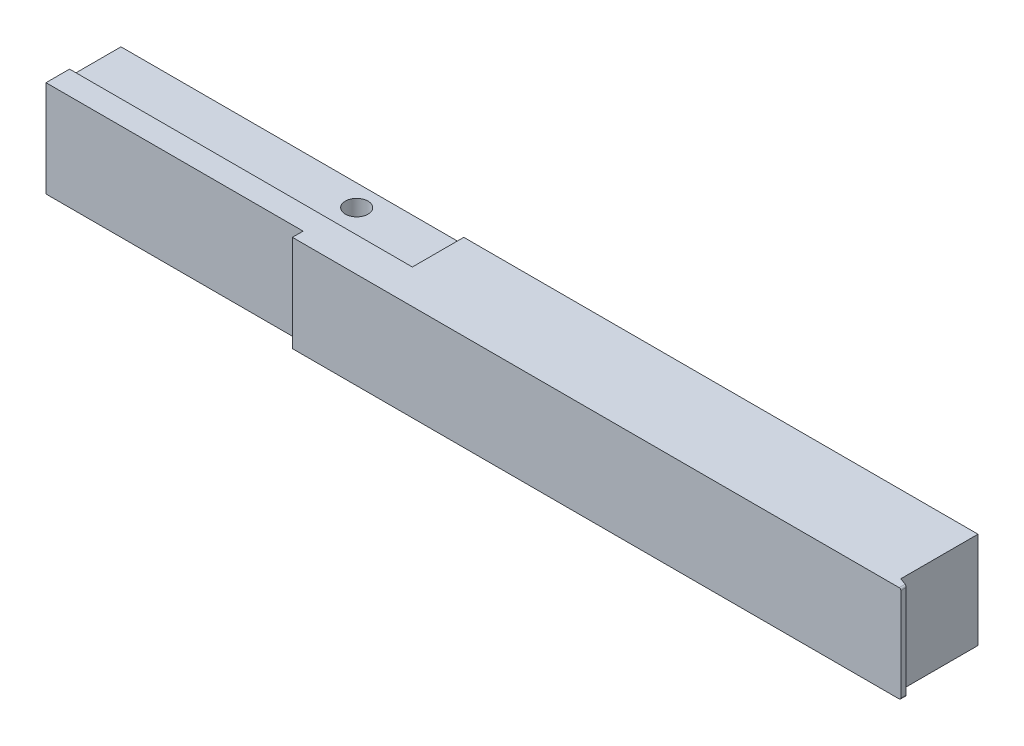
ISO-10303-21;
HEADER;
FILE_DESCRIPTION(('STEP AP214'),'2;1');
FILE_NAME('part.step','',(''),(''),'','','');
FILE_SCHEMA(('AUTOMOTIVE_DESIGN { 1 0 10303 214 1 1 1 1 }'));
ENDSEC;
DATA;
#1=APPLICATION_CONTEXT('core data for automotive mechanical design processes');
#2=APPLICATION_PROTOCOL_DEFINITION('international standard','automotive_design',2000,#1);
#3=PRODUCT_CONTEXT('',#1,'mechanical');
#4=PRODUCT('Part','Part','',(#3));
#5=PRODUCT_RELATED_PRODUCT_CATEGORY('part','',(#4));
#6=PRODUCT_DEFINITION_FORMATION('','',#4);
#7=PRODUCT_DEFINITION_CONTEXT('part definition',#1,'design');
#8=PRODUCT_DEFINITION('design','',#6,#7);
#9=PRODUCT_DEFINITION_SHAPE('','',#8);
#10=(LENGTH_UNIT() NAMED_UNIT(*) SI_UNIT(.MILLI.,.METRE.));
#11=(NAMED_UNIT(*) PLANE_ANGLE_UNIT() SI_UNIT($,.RADIAN.));
#12=(NAMED_UNIT(*) SI_UNIT($,.STERADIAN.) SOLID_ANGLE_UNIT());
#13=UNCERTAINTY_MEASURE_WITH_UNIT(LENGTH_MEASURE(1.E-05),#10,'distance_accuracy_value','');
#14=(GEOMETRIC_REPRESENTATION_CONTEXT(3) GLOBAL_UNCERTAINTY_ASSIGNED_CONTEXT((#13)) GLOBAL_UNIT_ASSIGNED_CONTEXT((#10,
#11,#12)) REPRESENTATION_CONTEXT('',''));
#15=CARTESIAN_POINT('',(0.,0.,0.));
#16=DIRECTION('',(0.,0.,1.));
#17=DIRECTION('',(1.,0.,0.));
#18=AXIS2_PLACEMENT_3D('',#15,#16,#17);
#19=CARTESIAN_POINT('',(-32.1114230553075,19.7029035328875,11.961938638472));
#20=DIRECTION('',(0.,-1.,0.));
#21=DIRECTION('',(1.,0.,0.));
#22=AXIS2_PLACEMENT_3D('',#19,#20,#21);
#23=PLANE('',#22);
#24=DIRECTION('',(0.,0.,1.));
#25=VECTOR('',#24,1.);
#26=CARTESIAN_POINT('',(-32.1114230553075,19.7029035328875,11.961938638472));
#27=LINE('',#26,#25);
#28=CARTESIAN_POINT('',(-32.1114230553075,19.7029035328875,23.961938638472));
#29=VERTEX_POINT('',#28);
#30=CARTESIAN_POINT('',(-32.1114230553075,19.7029035328875,29.461938638472));
#31=VERTEX_POINT('',#30);
#32=EDGE_CURVE('E276',#29,#31,#27,.T.);
#33=ORIENTED_EDGE('',*,*,#32,.F.);
#34=DIRECTION('',(1.,0.,0.));
#35=VECTOR('',#34,1.);
#36=CARTESIAN_POINT('',(-32.1114230553075,19.7029035328875,23.961938638472));
#37=LINE('',#36,#35);
#38=CARTESIAN_POINT('',(47.8885769446925,19.7029035328875,23.961938638472));
#39=VERTEX_POINT('',#38);
#40=EDGE_CURVE('E377',#29,#39,#37,.T.);
#41=ORIENTED_EDGE('',*,*,#40,.T.);
#42=DIRECTION('',(0.,0.,-1.));
#43=VECTOR('',#42,1.);
#44=CARTESIAN_POINT('',(47.8885769446925,19.7029035328875,11.961938638472));
#45=LINE('',#44,#43);
#46=CARTESIAN_POINT('',(47.8885769446925,19.7029035328875,11.961938638472));
#47=VERTEX_POINT('',#46);
#48=EDGE_CURVE('E380',#39,#47,#45,.T.);
#49=ORIENTED_EDGE('',*,*,#48,.T.);
#50=DIRECTION('',(1.,0.,0.));
#51=VECTOR('',#50,1.);
#52=CARTESIAN_POINT('',(-32.1114230553075,19.7029035328875,11.961938638472));
#53=LINE('',#52,#51);
#54=CARTESIAN_POINT('',(167.888576944693,19.7029035328876,11.961938638472));
#55=VERTEX_POINT('',#54);
#56=EDGE_CURVE('E186',#47,#55,#53,.T.);
#57=ORIENTED_EDGE('',*,*,#56,.T.);
#58=DIRECTION('',(0.,0.,1.));
#59=VECTOR('',#58,1.);
#60=CARTESIAN_POINT('',(167.888576944693,19.7029035328876,11.961938638472));
#61=LINE('',#60,#59);
#62=CARTESIAN_POINT('',(167.888576944693,19.7029035328876,29.9839981699396));
#63=VERTEX_POINT('',#62);
#64=EDGE_CURVE('E255',#55,#63,#61,.T.);
#65=ORIENTED_EDGE('',*,*,#64,.T.);
#66=DIRECTION('',(-0.939692620785909,0.,-0.342020143325667));
#67=VECTOR('',#66,1.);
#68=CARTESIAN_POINT('',(-14.5080456511358,19.7029035328875,-36.4029432856278));
#69=LINE('',#68,#67);
#70=CARTESIAN_POINT('',(169.488576944692,19.7029035328876,30.5663505447655));
#71=VERTEX_POINT('',#70);
#72=EDGE_CURVE('E297',#63,#71,#69,.F.);
#73=ORIENTED_EDGE('',*,*,#72,.T.);
#74=DIRECTION('',(0.,0.,1.));
#75=VECTOR('',#74,1.);
#76=CARTESIAN_POINT('',(169.488576944693,19.7029035328876,11.961938638472));
#77=LINE('',#76,#75);
#78=CARTESIAN_POINT('',(169.488576944693,19.7029035328876,31.961938638472));
#79=VERTEX_POINT('',#78);
#80=EDGE_CURVE('E305',#71,#79,#77,.T.);
#81=ORIENTED_EDGE('',*,*,#80,.T.);
#82=DIRECTION('',(1.,0.,0.));
#83=VECTOR('',#82,1.);
#84=CARTESIAN_POINT('',(-32.1114230553075,19.7029035328875,31.961938638472));
#85=LINE('',#84,#83);
#86=CARTESIAN_POINT('',(27.8885769446925,19.7029035328875,31.961938638472));
#87=VERTEX_POINT('',#86);
#88=EDGE_CURVE('E271',#87,#79,#85,.T.);
#89=ORIENTED_EDGE('',*,*,#88,.F.);
#90=DIRECTION('',(0.,0.,-1.));
#91=VECTOR('',#90,1.);
#92=CARTESIAN_POINT('',(27.8885769446925,19.7029035328875,31.961938638472));
#93=LINE('',#92,#91);
#94=CARTESIAN_POINT('',(27.8885769446925,19.7029035328875,29.461938638472));
#95=VERTEX_POINT('',#94);
#96=EDGE_CURVE('E237',#87,#95,#93,.T.);
#97=ORIENTED_EDGE('',*,*,#96,.T.);
#98=DIRECTION('',(-1.,0.,0.));
#99=VECTOR('',#98,1.);
#100=CARTESIAN_POINT('',(27.8885769446925,19.7029035328875,29.461938638472));
#101=LINE('',#100,#99);
#102=EDGE_CURVE('E242',#95,#31,#101,.T.);
#103=ORIENTED_EDGE('',*,*,#102,.T.);
#104=EDGE_LOOP('',(#33,#41,#49,#57,#65,#73,#81,#89,#97,#103));
#105=FACE_BOUND('',#104,.T.);
#106=ADVANCED_FACE('F49',(#105),#23,.T.);
#107=CARTESIAN_POINT('',(-32.1114230553075,19.7029035328875,11.961938638472));
#108=DIRECTION('',(1.,0.,0.));
#109=DIRECTION('',(0.,0.,-1.));
#110=AXIS2_PLACEMENT_3D('',#107,#108,#109);
#111=PLANE('',#110);
#112=DIRECTION('',(0.,-1.,0.));
#113=VECTOR('',#112,1.);
#114=CARTESIAN_POINT('',(-32.1114230553075,21.2029035328875,23.961938638472));
#115=LINE('',#114,#113);
#116=CARTESIAN_POINT('',(-32.1114230553075,21.2029035328875,23.961938638472));
#117=VERTEX_POINT('',#116);
#118=EDGE_CURVE('E191',#117,#29,#115,.T.);
#119=ORIENTED_EDGE('',*,*,#118,.T.);
#120=ORIENTED_EDGE('',*,*,#32,.T.);
#121=DIRECTION('',(0.,1.,0.));
#122=VECTOR('',#121,1.);
#123=CARTESIAN_POINT('',(-32.1114230553075,-40.349157214434,29.461938638472));
#124=LINE('',#123,#122);
#125=CARTESIAN_POINT('',(-32.1114230553075,42.2029035328875,29.461938638472));
#126=VERTEX_POINT('',#125);
#127=EDGE_CURVE('E246',#31,#126,#124,.T.);
#128=ORIENTED_EDGE('',*,*,#127,.T.);
#129=DIRECTION('',(0.,0.,1.));
#130=VECTOR('',#129,1.);
#131=CARTESIAN_POINT('',(-32.1114230553075,42.2029035328875,11.961938638472));
#132=LINE('',#131,#130);
#133=CARTESIAN_POINT('',(-32.1114230553075,42.2029035328875,23.961938638472));
#134=VERTEX_POINT('',#133);
#135=EDGE_CURVE('E287',#134,#126,#132,.T.);
#136=ORIENTED_EDGE('',*,*,#135,.F.);
#137=DIRECTION('',(0.,1.,0.));
#138=VECTOR('',#137,1.);
#139=CARTESIAN_POINT('',(-32.1114230553075,40.7029035328875,23.961938638472));
#140=LINE('',#139,#138);
#141=CARTESIAN_POINT('',(-32.1114230553075,40.7029035328875,23.961938638472));
#142=VERTEX_POINT('',#141);
#143=EDGE_CURVE('E214',#142,#134,#140,.T.);
#144=ORIENTED_EDGE('',*,*,#143,.F.);
#145=DIRECTION('',(0.,0.,1.));
#146=VECTOR('',#145,1.);
#147=CARTESIAN_POINT('',(-32.1114230553075,40.7029035328875,11.961938638472));
#148=LINE('',#147,#146);
#149=CARTESIAN_POINT('',(-32.1114230553075,40.7029035328875,11.961938638472));
#150=VERTEX_POINT('',#149);
#151=EDGE_CURVE('E201',#150,#142,#148,.T.);
#152=ORIENTED_EDGE('',*,*,#151,.F.);
#153=DIRECTION('',(0.,1.,0.));
#154=VECTOR('',#153,1.);
#155=CARTESIAN_POINT('',(-32.1114230553075,19.7029035328875,11.961938638472));
#156=LINE('',#155,#154);
#157=CARTESIAN_POINT('',(-32.1114230553075,21.2029035328875,11.961938638472));
#158=VERTEX_POINT('',#157);
#159=EDGE_CURVE('E267',#158,#150,#156,.T.);
#160=ORIENTED_EDGE('',*,*,#159,.F.);
#161=DIRECTION('',(0.,0.,1.));
#162=VECTOR('',#161,1.);
#163=CARTESIAN_POINT('',(-32.1114230553075,21.2029035328875,11.961938638472));
#164=LINE('',#163,#162);
#165=EDGE_CURVE('E66',#158,#117,#164,.T.);
#166=ORIENTED_EDGE('',*,*,#165,.T.);
#167=EDGE_LOOP('',(#119,#120,#128,#136,#144,#152,#160,#166));
#168=FACE_BOUND('',#167,.T.);
#169=ADVANCED_FACE('F369',(#168),#111,.F.);
#170=CARTESIAN_POINT('',(-32.1114230553075,19.7029035328875,11.961938638472));
#171=DIRECTION('',(0.,0.,-1.));
#172=DIRECTION('',(-1.,0.,0.));
#173=AXIS2_PLACEMENT_3D('',#170,#171,#172);
#174=PLANE('',#173);
#175=ORIENTED_EDGE('',*,*,#56,.F.);
#176=DIRECTION('',(0.,-1.,0.));
#177=VECTOR('',#176,1.);
#178=CARTESIAN_POINT('',(47.8885769446925,21.2029035328875,11.961938638472));
#179=LINE('',#178,#177);
#180=CARTESIAN_POINT('',(47.8885769446925,21.2029035328875,11.961938638472));
#181=VERTEX_POINT('',#180);
#182=EDGE_CURVE('E170',#181,#47,#179,.T.);
#183=ORIENTED_EDGE('',*,*,#182,.F.);
#184=DIRECTION('',(-1.,0.,0.));
#185=VECTOR('',#184,1.);
#186=CARTESIAN_POINT('',(-32.1114230553075,21.2029035328875,11.961938638472));
#187=LINE('',#186,#185);
#188=EDGE_CURVE('E175',#181,#158,#187,.T.);
#189=ORIENTED_EDGE('',*,*,#188,.T.);
#190=ORIENTED_EDGE('',*,*,#159,.T.);
#191=DIRECTION('',(-1.,0.,0.));
#192=VECTOR('',#191,1.);
#193=CARTESIAN_POINT('',(-32.1114230553075,40.7029035328875,11.961938638472));
#194=LINE('',#193,#192);
#195=CARTESIAN_POINT('',(47.8885769446925,40.7029035328875,11.961938638472));
#196=VERTEX_POINT('',#195);
#197=EDGE_CURVE('E211',#196,#150,#194,.T.);
#198=ORIENTED_EDGE('',*,*,#197,.F.);
#199=DIRECTION('',(0.,1.,0.));
#200=VECTOR('',#199,1.);
#201=CARTESIAN_POINT('',(47.8885769446925,40.7029035328875,11.961938638472));
#202=LINE('',#201,#200);
#203=CARTESIAN_POINT('',(47.8885769446925,42.2029035328875,11.961938638472));
#204=VERTEX_POINT('',#203);
#205=EDGE_CURVE('E220',#196,#204,#202,.T.);
#206=ORIENTED_EDGE('',*,*,#205,.T.);
#207=DIRECTION('',(1.,0.,0.));
#208=VECTOR('',#207,1.);
#209=CARTESIAN_POINT('',(-32.1114230553075,42.2029035328875,11.961938638472));
#210=LINE('',#209,#208);
#211=CARTESIAN_POINT('',(167.888576944693,42.2029035328876,11.961938638472));
#212=VERTEX_POINT('',#211);
#213=EDGE_CURVE('E270',#204,#212,#210,.T.);
#214=ORIENTED_EDGE('',*,*,#213,.T.);
#215=DIRECTION('',(0.,1.,0.));
#216=VECTOR('',#215,1.);
#217=CARTESIAN_POINT('',(167.888576944693,19.7029035328876,11.961938638472));
#218=LINE('',#217,#216);
#219=EDGE_CURVE('E262',#55,#212,#218,.T.);
#220=ORIENTED_EDGE('',*,*,#219,.F.);
#221=EDGE_LOOP('',(#175,#183,#189,#190,#198,#206,#214,#220));
#222=FACE_BOUND('',#221,.T.);
#223=ADVANCED_FACE('F184',(#222),#174,.T.);
#224=CARTESIAN_POINT('',(27.8885769446925,19.7019035328875,16.961938638472));
#225=DIRECTION('',(0.,1.,0.));
#226=DIRECTION('',(-1.,0.,0.));
#227=AXIS2_PLACEMENT_3D('',#224,#225,#226);
#228=CYLINDRICAL_SURFACE('',#227,2.65);
#229=CARTESIAN_POINT('',(27.8885769446925,40.7029035328875,16.961938638472));
#230=DIRECTION('',(0.,1.,0.));
#231=DIRECTION('',(-1.,0.,0.));
#232=AXIS2_PLACEMENT_3D('',#229,#230,#231);
#233=CIRCLE('',#232,2.65);
#234=CARTESIAN_POINT('',(25.2385769446925,40.7029035328875,16.961938638472));
#235=VERTEX_POINT('',#234);
#236=EDGE_CURVE('E196',#235,#235,#233,.T.);
#237=ORIENTED_EDGE('',*,*,#236,.T.);
#238=EDGE_LOOP('',(#237));
#239=FACE_BOUND('',#238,.T.);
#240=CARTESIAN_POINT('',(27.8885769446925,21.2029035328875,16.961938638472));
#241=DIRECTION('',(0.,-1.,0.));
#242=DIRECTION('',(1.,0.,0.));
#243=AXIS2_PLACEMENT_3D('',#240,#241,#242);
#244=CIRCLE('',#243,2.65);
#245=CARTESIAN_POINT('',(30.5385769446925,21.2029035328875,16.961938638472));
#246=VERTEX_POINT('',#245);
#247=EDGE_CURVE('E53',#246,#246,#244,.F.);
#248=ORIENTED_EDGE('',*,*,#247,.F.);
#249=EDGE_LOOP('',(#248));
#250=FACE_BOUND('',#249,.T.);
#251=ADVANCED_FACE('F407',(#239,#250),#228,.F.);
#252=CARTESIAN_POINT('',(-32.1114230553075,42.2029035328875,11.961938638472));
#253=DIRECTION('',(0.,-1.,0.));
#254=DIRECTION('',(1.,0.,0.));
#255=AXIS2_PLACEMENT_3D('',#252,#253,#254);
#256=PLANE('',#255);
#257=ORIENTED_EDGE('',*,*,#213,.F.);
#258=DIRECTION('',(0.,0.,-1.));
#259=VECTOR('',#258,1.);
#260=CARTESIAN_POINT('',(47.8885769446925,42.2029035328875,11.961938638472));
#261=LINE('',#260,#259);
#262=CARTESIAN_POINT('',(47.8885769446925,42.2029035328875,23.961938638472));
#263=VERTEX_POINT('',#262);
#264=EDGE_CURVE('E206',#263,#204,#261,.T.);
#265=ORIENTED_EDGE('',*,*,#264,.F.);
#266=DIRECTION('',(1.,0.,0.));
#267=VECTOR('',#266,1.);
#268=CARTESIAN_POINT('',(-32.1114230553075,42.2029035328875,23.961938638472));
#269=LINE('',#268,#267);
#270=EDGE_CURVE('E200',#134,#263,#269,.T.);
#271=ORIENTED_EDGE('',*,*,#270,.F.);
#272=ORIENTED_EDGE('',*,*,#135,.T.);
#273=DIRECTION('',(-1.,0.,0.));
#274=VECTOR('',#273,1.);
#275=CARTESIAN_POINT('',(27.8885769446925,42.2029035328875,29.461938638472));
#276=LINE('',#275,#274);
#277=CARTESIAN_POINT('',(27.8885769446925,42.2029035328875,29.461938638472));
#278=VERTEX_POINT('',#277);
#279=EDGE_CURVE('E233',#278,#126,#276,.T.);
#280=ORIENTED_EDGE('',*,*,#279,.F.);
#281=DIRECTION('',(0.,0.,-1.));
#282=VECTOR('',#281,1.);
#283=CARTESIAN_POINT('',(27.8885769446925,42.2029035328875,31.961938638472));
#284=LINE('',#283,#282);
#285=CARTESIAN_POINT('',(27.8885769446925,42.2029035328875,31.961938638472));
#286=VERTEX_POINT('',#285);
#287=EDGE_CURVE('E224',#286,#278,#284,.T.);
#288=ORIENTED_EDGE('',*,*,#287,.F.);
#289=DIRECTION('',(1.,0.,0.));
#290=VECTOR('',#289,1.);
#291=CARTESIAN_POINT('',(-32.1114230553075,42.2029035328875,31.961938638472));
#292=LINE('',#291,#290);
#293=CARTESIAN_POINT('',(169.488576944693,42.2029035328876,31.961938638472));
#294=VERTEX_POINT('',#293);
#295=EDGE_CURVE('E266',#286,#294,#292,.T.);
#296=ORIENTED_EDGE('',*,*,#295,.T.);
#297=DIRECTION('',(0.,0.,1.));
#298=VECTOR('',#297,1.);
#299=CARTESIAN_POINT('',(169.488576944693,42.2029035328876,30.711938638472));
#300=LINE('',#299,#298);
#301=CARTESIAN_POINT('',(169.488576944693,42.2029035328876,30.5663505447655));
#302=VERTEX_POINT('',#301);
#303=EDGE_CURVE('E11',#294,#302,#300,.F.);
#304=ORIENTED_EDGE('',*,*,#303,.T.);
#305=DIRECTION('',(0.939692620785909,0.,0.342020143325667));
#306=VECTOR('',#305,1.);
#307=CARTESIAN_POINT('',(169.888576944693,42.2029035328876,30.711938638472));
#308=LINE('',#307,#306);
#309=CARTESIAN_POINT('',(167.888576944693,42.2029035328876,29.9839981699396));
#310=VERTEX_POINT('',#309);
#311=EDGE_CURVE('E294',#302,#310,#308,.F.);
#312=ORIENTED_EDGE('',*,*,#311,.T.);
#313=DIRECTION('',(0.,0.,1.));
#314=VECTOR('',#313,1.);
#315=CARTESIAN_POINT('',(167.888576944693,42.2029035328876,11.961938638472));
#316=LINE('',#315,#314);
#317=EDGE_CURVE('E258',#212,#310,#316,.T.);
#318=ORIENTED_EDGE('',*,*,#317,.F.);
#319=EDGE_LOOP('',(#257,#265,#271,#272,#280,#288,#296,#304,#312,#318));
#320=FACE_BOUND('',#319,.T.);
#321=ADVANCED_FACE('F356',(#320),#256,.F.);
#322=CARTESIAN_POINT('',(169.888576944693,19.7029035328876,11.961938638472));
#323=DIRECTION('',(1.,0.,0.));
#324=DIRECTION('',(0.,0.,-1.));
#325=AXIS2_PLACEMENT_3D('',#322,#323,#324);
#326=PLANE('',#325);
#327=DIRECTION('',(0.,1.,0.));
#328=VECTOR('',#327,1.);
#329=CARTESIAN_POINT('',(169.888576944693,19.7029035328876,31.961938638472));
#330=LINE('',#329,#328);
#331=CARTESIAN_POINT('',(169.888576944693,20.1029035328876,31.961938638472));
#332=VERTEX_POINT('',#331);
#333=CARTESIAN_POINT('',(169.888576944693,41.8029035328876,31.961938638472));
#334=VERTEX_POINT('',#333);
#335=EDGE_CURVE('E279',#332,#334,#330,.T.);
#336=ORIENTED_EDGE('',*,*,#335,.F.);
#337=DIRECTION('',(0.,0.,1.));
#338=VECTOR('',#337,1.);
#339=CARTESIAN_POINT('',(169.888576944693,20.1029035328876,11.961938638472));
#340=LINE('',#339,#338);
#341=CARTESIAN_POINT('',(169.888576944693,20.1029035328876,30.711938638472));
#342=VERTEX_POINT('',#341);
#343=EDGE_CURVE('E320',#332,#342,#340,.F.);
#344=ORIENTED_EDGE('',*,*,#343,.T.);
#345=DIRECTION('',(0.,1.,0.));
#346=VECTOR('',#345,1.);
#347=CARTESIAN_POINT('',(169.888576944693,19.7029035328876,30.711938638472));
#348=LINE('',#347,#346);
#349=CARTESIAN_POINT('',(169.888576944693,41.8029035328876,30.711938638472));
#350=VERTEX_POINT('',#349);
#351=EDGE_CURVE('E290',#342,#350,#348,.T.);
#352=ORIENTED_EDGE('',*,*,#351,.T.);
#353=DIRECTION('',(0.,0.,1.));
#354=VECTOR('',#353,1.);
#355=CARTESIAN_POINT('',(169.888576944693,41.8029035328876,31.961938638472));
#356=LINE('',#355,#354);
#357=EDGE_CURVE('E316',#350,#334,#356,.T.);
#358=ORIENTED_EDGE('',*,*,#357,.T.);
#359=EDGE_LOOP('',(#336,#344,#352,#358));
#360=FACE_BOUND('',#359,.T.);
#361=ADVANCED_FACE('F348',(#360),#326,.T.);
#362=CARTESIAN_POINT('',(-32.1114230553075,19.7029035328875,31.961938638472));
#363=DIRECTION('',(0.,0.,-1.));
#364=DIRECTION('',(-1.,0.,0.));
#365=AXIS2_PLACEMENT_3D('',#362,#363,#364);
#366=PLANE('',#365);
#367=ORIENTED_EDGE('',*,*,#295,.F.);
#368=DIRECTION('',(0.,1.,0.));
#369=VECTOR('',#368,1.);
#370=CARTESIAN_POINT('',(27.8885769446925,-40.349157214434,31.961938638472));
#371=LINE('',#370,#369);
#372=EDGE_CURVE('E250',#87,#286,#371,.T.);
#373=ORIENTED_EDGE('',*,*,#372,.F.);
#374=ORIENTED_EDGE('',*,*,#88,.T.);
#375=CARTESIAN_POINT('',(169.488576944693,20.1029035328876,31.961938638472));
#376=DIRECTION('',(0.,0.,-1.));
#377=DIRECTION('',(-1.,0.,0.));
#378=AXIS2_PLACEMENT_3D('',#375,#376,#377);
#379=CIRCLE('',#378,0.4);
#380=EDGE_CURVE('E313',#79,#332,#379,.F.);
#381=ORIENTED_EDGE('',*,*,#380,.T.);
#382=ORIENTED_EDGE('',*,*,#335,.T.);
#383=CARTESIAN_POINT('',(169.488576944693,41.8029035328876,31.961938638472));
#384=DIRECTION('',(0.,0.,-1.));
#385=DIRECTION('',(-1.,0.,0.));
#386=AXIS2_PLACEMENT_3D('',#383,#384,#385);
#387=CIRCLE('',#386,0.4);
#388=EDGE_CURVE('E309',#334,#294,#387,.F.);
#389=ORIENTED_EDGE('',*,*,#388,.T.);
#390=EDGE_LOOP('',(#367,#373,#374,#381,#382,#389));
#391=FACE_BOUND('',#390,.T.);
#392=ADVANCED_FACE('F345',(#391),#366,.F.);
#393=CARTESIAN_POINT('',(167.888576944693,19.7029035328875,31.961938638472));
#394=DIRECTION('',(-1.,0.,0.));
#395=DIRECTION('',(0.,0.,1.));
#396=AXIS2_PLACEMENT_3D('',#393,#394,#395);
#397=PLANE('',#396);
#398=ORIENTED_EDGE('',*,*,#64,.F.);
#399=ORIENTED_EDGE('',*,*,#219,.T.);
#400=ORIENTED_EDGE('',*,*,#317,.T.);
#401=DIRECTION('',(0.,1.,0.));
#402=VECTOR('',#401,1.);
#403=CARTESIAN_POINT('',(167.888576944693,19.7029035328875,29.9839981699396));
#404=LINE('',#403,#402);
#405=EDGE_CURVE('E301',#310,#63,#404,.F.);
#406=ORIENTED_EDGE('',*,*,#405,.T.);
#407=EDGE_LOOP('',(#398,#399,#400,#406));
#408=FACE_BOUND('',#407,.T.);
#409=ADVANCED_FACE('F413',(#408),#397,.F.);
#410=CARTESIAN_POINT('',(169.888576944693,19.7029035328876,30.711938638472));
#411=DIRECTION('',(-0.342020143325667,0.,0.939692620785909));
#412=DIRECTION('',(0.,1.,0.));
#413=AXIS2_PLACEMENT_3D('',#410,#411,#412);
#414=PLANE('',#413);
#415=ORIENTED_EDGE('',*,*,#351,.F.);
#416=CARTESIAN_POINT('',(169.488576944693,20.1029035328876,30.5663505447655));
#417=DIRECTION('',(-0.342020143325667,0.,0.939692620785909));
#418=DIRECTION('',(0.939692620785909,0.,0.342020143325667));
#419=AXIS2_PLACEMENT_3D('',#416,#417,#418);
#420=ELLIPSE('',#419,0.425671108990365,0.4);
#421=EDGE_CURVE('E59',#342,#71,#420,.F.);
#422=ORIENTED_EDGE('',*,*,#421,.T.);
#423=ORIENTED_EDGE('',*,*,#72,.F.);
#424=ORIENTED_EDGE('',*,*,#405,.F.);
#425=ORIENTED_EDGE('',*,*,#311,.F.);
#426=CARTESIAN_POINT('',(169.488576944693,41.8029035328876,30.5663505447655));
#427=DIRECTION('',(-0.342020143325667,0.,0.939692620785909));
#428=DIRECTION('',(-0.939692620785909,0.,-0.342020143325667));
#429=AXIS2_PLACEMENT_3D('',#426,#427,#428);
#430=ELLIPSE('',#429,0.425671108990365,0.4);
#431=EDGE_CURVE('E323',#302,#350,#430,.F.);
#432=ORIENTED_EDGE('',*,*,#431,.T.);
#433=EDGE_LOOP('',(#415,#422,#423,#424,#425,#432));
#434=FACE_BOUND('',#433,.T.);
#435=ADVANCED_FACE('F331',(#434),#414,.F.);
#436=CARTESIAN_POINT('',(169.488576944693,20.1029035328876,11.961938638472));
#437=DIRECTION('',(0.,0.,1.));
#438=DIRECTION('',(1.,0.,0.));
#439=AXIS2_PLACEMENT_3D('',#436,#437,#438);
#440=CYLINDRICAL_SURFACE('',#439,0.4);
#441=ORIENTED_EDGE('',*,*,#421,.F.);
#442=ORIENTED_EDGE('',*,*,#343,.F.);
#443=ORIENTED_EDGE('',*,*,#380,.F.);
#444=ORIENTED_EDGE('',*,*,#80,.F.);
#445=EDGE_LOOP('',(#441,#442,#443,#444));
#446=FACE_BOUND('',#445,.T.);
#447=ADVANCED_FACE('F341',(#446),#440,.T.);
#448=CARTESIAN_POINT('',(169.488576944693,41.8029035328876,11.961938638472));
#449=DIRECTION('',(0.,0.,-1.));
#450=DIRECTION('',(-1.,0.,0.));
#451=AXIS2_PLACEMENT_3D('',#448,#449,#450);
#452=CYLINDRICAL_SURFACE('',#451,0.4);
#453=ORIENTED_EDGE('',*,*,#431,.F.);
#454=ORIENTED_EDGE('',*,*,#303,.F.);
#455=ORIENTED_EDGE('',*,*,#388,.F.);
#456=ORIENTED_EDGE('',*,*,#357,.F.);
#457=EDGE_LOOP('',(#453,#454,#455,#456));
#458=FACE_BOUND('',#457,.T.);
#459=ADVANCED_FACE('F51',(#458),#452,.T.);
#460=CARTESIAN_POINT('',(27.8885769446925,-40.349157214434,31.961938638472));
#461=DIRECTION('',(1.,0.,0.));
#462=DIRECTION('',(0.,1.,0.));
#463=AXIS2_PLACEMENT_3D('',#460,#461,#462);
#464=PLANE('',#463);
#465=ORIENTED_EDGE('',*,*,#372,.T.);
#466=ORIENTED_EDGE('',*,*,#287,.T.);
#467=DIRECTION('',(0.,1.,0.));
#468=VECTOR('',#467,1.);
#469=CARTESIAN_POINT('',(27.8885769446925,-40.349157214434,29.461938638472));
#470=LINE('',#469,#468);
#471=EDGE_CURVE('E241',#95,#278,#470,.T.);
#472=ORIENTED_EDGE('',*,*,#471,.F.);
#473=ORIENTED_EDGE('',*,*,#96,.F.);
#474=EDGE_LOOP('',(#465,#466,#472,#473));
#475=FACE_BOUND('',#474,.T.);
#476=ADVANCED_FACE('F361',(#475),#464,.F.);
#477=CARTESIAN_POINT('',(27.8885769446925,-40.349157214434,29.461938638472));
#478=DIRECTION('',(0.,0.,-1.));
#479=DIRECTION('',(-1.,0.,0.));
#480=AXIS2_PLACEMENT_3D('',#477,#478,#479);
#481=PLANE('',#480);
#482=ORIENTED_EDGE('',*,*,#471,.T.);
#483=ORIENTED_EDGE('',*,*,#279,.T.);
#484=ORIENTED_EDGE('',*,*,#127,.F.);
#485=ORIENTED_EDGE('',*,*,#102,.F.);
#486=EDGE_LOOP('',(#482,#483,#484,#485));
#487=FACE_BOUND('',#486,.T.);
#488=ADVANCED_FACE('F365',(#487),#481,.F.);
#489=CARTESIAN_POINT('',(47.8885769446925,40.7029035328875,11.961938638472));
#490=DIRECTION('',(1.,0.,0.));
#491=DIRECTION('',(0.,0.,-1.));
#492=AXIS2_PLACEMENT_3D('',#489,#490,#491);
#493=PLANE('',#492);
#494=ORIENTED_EDGE('',*,*,#264,.T.);
#495=ORIENTED_EDGE('',*,*,#205,.F.);
#496=DIRECTION('',(0.,0.,-1.));
#497=VECTOR('',#496,1.);
#498=CARTESIAN_POINT('',(47.8885769446925,40.7029035328875,11.961938638472));
#499=LINE('',#498,#497);
#500=CARTESIAN_POINT('',(47.8885769446925,40.7029035328875,23.961938638472));
#501=VERTEX_POINT('',#500);
#502=EDGE_CURVE('E74',#501,#196,#499,.T.);
#503=ORIENTED_EDGE('',*,*,#502,.F.);
#504=DIRECTION('',(0.,1.,0.));
#505=VECTOR('',#504,1.);
#506=CARTESIAN_POINT('',(47.8885769446925,40.7029035328875,23.961938638472));
#507=LINE('',#506,#505);
#508=EDGE_CURVE('E225',#501,#263,#507,.T.);
#509=ORIENTED_EDGE('',*,*,#508,.T.);
#510=EDGE_LOOP('',(#494,#495,#503,#509));
#511=FACE_BOUND('',#510,.T.);
#512=ADVANCED_FACE('F425',(#511),#493,.F.);
#513=CARTESIAN_POINT('',(-32.1114230553075,40.7029035328875,23.961938638472));
#514=DIRECTION('',(0.,0.,1.));
#515=DIRECTION('',(1.,0.,0.));
#516=AXIS2_PLACEMENT_3D('',#513,#514,#515);
#517=PLANE('',#516);
#518=ORIENTED_EDGE('',*,*,#270,.T.);
#519=ORIENTED_EDGE('',*,*,#508,.F.);
#520=DIRECTION('',(1.,0.,0.));
#521=VECTOR('',#520,1.);
#522=CARTESIAN_POINT('',(-32.1114230553075,40.7029035328875,23.961938638472));
#523=LINE('',#522,#521);
#524=EDGE_CURVE('E205',#142,#501,#523,.T.);
#525=ORIENTED_EDGE('',*,*,#524,.F.);
#526=ORIENTED_EDGE('',*,*,#143,.T.);
#527=EDGE_LOOP('',(#518,#519,#525,#526));
#528=FACE_BOUND('',#527,.T.);
#529=ADVANCED_FACE('F442',(#528),#517,.F.);
#530=CARTESIAN_POINT('',(0.,40.7029035328875,0.));
#531=DIRECTION('',(0.,1.,0.));
#532=DIRECTION('',(-1.,0.,0.));
#533=AXIS2_PLACEMENT_3D('',#530,#531,#532);
#534=PLANE('',#533);
#535=ORIENTED_EDGE('',*,*,#236,.F.);
#536=EDGE_LOOP('',(#535));
#537=FACE_BOUND('',#536,.T.);
#538=ORIENTED_EDGE('',*,*,#151,.T.);
#539=ORIENTED_EDGE('',*,*,#524,.T.);
#540=ORIENTED_EDGE('',*,*,#502,.T.);
#541=ORIENTED_EDGE('',*,*,#197,.T.);
#542=EDGE_LOOP('',(#538,#539,#540,#541));
#543=FACE_BOUND('',#542,.T.);
#544=ADVANCED_FACE('F392',(#537,#543),#534,.T.);
#545=CARTESIAN_POINT('',(0.,21.2029035328875,0.));
#546=DIRECTION('',(0.,-1.,0.));
#547=DIRECTION('',(-1.,0.,0.));
#548=AXIS2_PLACEMENT_3D('',#545,#546,#547);
#549=PLANE('',#548);
#550=ORIENTED_EDGE('',*,*,#165,.F.);
#551=ORIENTED_EDGE('',*,*,#188,.F.);
#552=DIRECTION('',(0.,0.,-1.));
#553=VECTOR('',#552,1.);
#554=CARTESIAN_POINT('',(47.8885769446925,21.2029035328875,11.961938638472));
#555=LINE('',#554,#553);
#556=CARTESIAN_POINT('',(47.8885769446925,21.2029035328875,23.961938638472));
#557=VERTEX_POINT('',#556);
#558=EDGE_CURVE('E166',#557,#181,#555,.T.);
#559=ORIENTED_EDGE('',*,*,#558,.F.);
#560=DIRECTION('',(1.,0.,0.));
#561=VECTOR('',#560,1.);
#562=CARTESIAN_POINT('',(-32.1114230553075,21.2029035328875,23.961938638472));
#563=LINE('',#562,#561);
#564=EDGE_CURVE('E174',#117,#557,#563,.T.);
#565=ORIENTED_EDGE('',*,*,#564,.F.);
#566=EDGE_LOOP('',(#550,#551,#559,#565));
#567=FACE_BOUND('',#566,.T.);
#568=ORIENTED_EDGE('',*,*,#247,.T.);
#569=EDGE_LOOP('',(#568));
#570=FACE_BOUND('',#569,.T.);
#571=ADVANCED_FACE('F177',(#567,#570),#549,.T.);
#572=CARTESIAN_POINT('',(-32.1114230553075,21.2029035328875,23.961938638472));
#573=DIRECTION('',(0.,0.,-1.));
#574=DIRECTION('',(-1.,0.,0.));
#575=AXIS2_PLACEMENT_3D('',#572,#573,#574);
#576=PLANE('',#575);
#577=ORIENTED_EDGE('',*,*,#40,.F.);
#578=ORIENTED_EDGE('',*,*,#118,.F.);
#579=ORIENTED_EDGE('',*,*,#564,.T.);
#580=DIRECTION('',(0.,-1.,0.));
#581=VECTOR('',#580,1.);
#582=CARTESIAN_POINT('',(47.8885769446925,21.2029035328875,23.961938638472));
#583=LINE('',#582,#581);
#584=EDGE_CURVE('E172',#557,#39,#583,.T.);
#585=ORIENTED_EDGE('',*,*,#584,.T.);
#586=EDGE_LOOP('',(#577,#578,#579,#585));
#587=FACE_BOUND('',#586,.T.);
#588=ADVANCED_FACE('F384',(#587),#576,.T.);
#589=CARTESIAN_POINT('',(47.8885769446925,21.2029035328875,11.961938638472));
#590=DIRECTION('',(-1.,0.,0.));
#591=DIRECTION('',(0.,0.,1.));
#592=AXIS2_PLACEMENT_3D('',#589,#590,#591);
#593=PLANE('',#592);
#594=ORIENTED_EDGE('',*,*,#48,.F.);
#595=ORIENTED_EDGE('',*,*,#584,.F.);
#596=ORIENTED_EDGE('',*,*,#558,.T.);
#597=ORIENTED_EDGE('',*,*,#182,.T.);
#598=EDGE_LOOP('',(#594,#595,#596,#597));
#599=FACE_BOUND('',#598,.T.);
#600=ADVANCED_FACE('F168',(#599),#593,.T.);
#601=CLOSED_SHELL('',(#106,#169,#223,#251,#321,#361,#392,#409,#435,#447,#459,#476,#488,#512,
#529,#544,#571,#588,#600));
#602=MANIFOLD_SOLID_BREP('B2',#601);
#603=ADVANCED_BREP_SHAPE_REPRESENTATION('',(#18,#602),#14);
#604=SHAPE_DEFINITION_REPRESENTATION(#9,#603);
ENDSEC;
END-ISO-10303-21;
